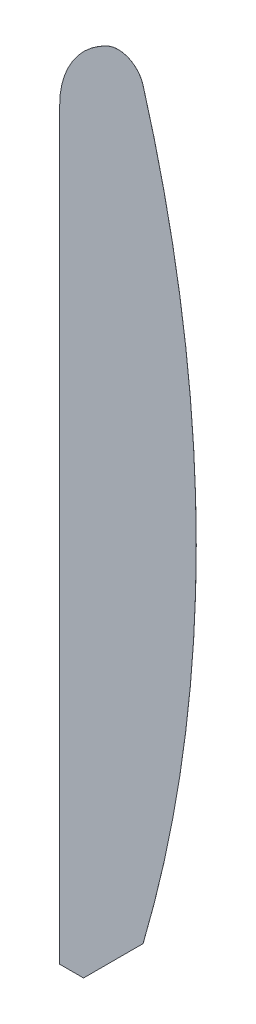
ISO-10303-21;
HEADER;
FILE_DESCRIPTION(('STEP AP214'),'2;1');
FILE_NAME('part.step','',(''),(''),'','','');
FILE_SCHEMA(('AUTOMOTIVE_DESIGN { 1 0 10303 214 1 1 1 1 }'));
ENDSEC;
DATA;
#1=APPLICATION_CONTEXT('core data for automotive mechanical design processes');
#2=APPLICATION_PROTOCOL_DEFINITION('international standard','automotive_design',2000,#1);
#3=PRODUCT_CONTEXT('',#1,'mechanical');
#4=PRODUCT('Part','Part','',(#3));
#5=PRODUCT_RELATED_PRODUCT_CATEGORY('part','',(#4));
#6=PRODUCT_DEFINITION_FORMATION('','',#4);
#7=PRODUCT_DEFINITION_CONTEXT('part definition',#1,'design');
#8=PRODUCT_DEFINITION('design','',#6,#7);
#9=PRODUCT_DEFINITION_SHAPE('','',#8);
#10=(LENGTH_UNIT() NAMED_UNIT(*) SI_UNIT(.MILLI.,.METRE.));
#11=(NAMED_UNIT(*) PLANE_ANGLE_UNIT() SI_UNIT($,.RADIAN.));
#12=(NAMED_UNIT(*) SI_UNIT($,.STERADIAN.) SOLID_ANGLE_UNIT());
#13=UNCERTAINTY_MEASURE_WITH_UNIT(LENGTH_MEASURE(1.E-05),#10,'distance_accuracy_value','');
#14=(GEOMETRIC_REPRESENTATION_CONTEXT(3) GLOBAL_UNCERTAINTY_ASSIGNED_CONTEXT((#13)) GLOBAL_UNIT_ASSIGNED_CONTEXT((#10,
#11,#12)) REPRESENTATION_CONTEXT('',''));
#15=CARTESIAN_POINT('',(0.,0.,0.));
#16=DIRECTION('',(0.,0.,1.));
#17=DIRECTION('',(1.,0.,0.));
#18=AXIS2_PLACEMENT_3D('',#15,#16,#17);
#19=CARTESIAN_POINT('',(0.,0.,0.01));
#20=DIRECTION('',(0.,1.,0.));
#21=DIRECTION('',(-1.,0.,0.));
#22=AXIS2_PLACEMENT_3D('',#19,#20,#21);
#23=PLANE('',#22);
#24=DIRECTION('',(1.,0.,0.));
#25=VECTOR('',#24,1.);
#26=CARTESIAN_POINT('',(0.,0.,0.));
#27=LINE('',#26,#25);
#28=CARTESIAN_POINT('',(0.,0.,0.));
#29=VERTEX_POINT('',#28);
#30=CARTESIAN_POINT('',(5.,0.,0.));
#31=VERTEX_POINT('',#30);
#32=EDGE_CURVE('E124',#29,#31,#27,.T.);
#33=ORIENTED_EDGE('',*,*,#32,.T.);
#34=DIRECTION('',(0.,0.,-1.));
#35=VECTOR('',#34,1.);
#36=CARTESIAN_POINT('',(5.,0.,0.01));
#37=LINE('',#36,#35);
#38=CARTESIAN_POINT('',(5.,0.,0.01));
#39=VERTEX_POINT('',#38);
#40=EDGE_CURVE('E11',#39,#31,#37,.T.);
#41=ORIENTED_EDGE('',*,*,#40,.F.);
#42=DIRECTION('',(1.,0.,0.));
#43=VECTOR('',#42,1.);
#44=CARTESIAN_POINT('',(0.,0.,0.01));
#45=LINE('',#44,#43);
#46=CARTESIAN_POINT('',(0.,0.,0.01));
#47=VERTEX_POINT('',#46);
#48=EDGE_CURVE('E137',#47,#39,#45,.T.);
#49=ORIENTED_EDGE('',*,*,#48,.F.);
#50=DIRECTION('',(0.,0.,-1.));
#51=VECTOR('',#50,1.);
#52=CARTESIAN_POINT('',(0.,0.,0.01));
#53=LINE('',#52,#51);
#54=EDGE_CURVE('E54',#47,#29,#53,.T.);
#55=ORIENTED_EDGE('',*,*,#54,.T.);
#56=EDGE_LOOP('',(#33,#41,#49,#55));
#57=FACE_BOUND('',#56,.T.);
#58=ADVANCED_FACE('F39',(#57),#23,.F.);
#59=CARTESIAN_POINT('',(5.,0.,0.01));
#60=DIRECTION('',(-0.707106781186547,0.707106781186547,0.));
#61=DIRECTION('',(-0.707106781186548,-0.707106781186548,0.));
#62=AXIS2_PLACEMENT_3D('',#59,#60,#61);
#63=PLANE('',#62);
#64=DIRECTION('',(0.707106781186547,0.707106781186547,0.));
#65=VECTOR('',#64,1.);
#66=CARTESIAN_POINT('',(5.,0.,0.));
#67=LINE('',#66,#65);
#68=CARTESIAN_POINT('',(17.4999999999999,12.4999999999999,0.));
#69=VERTEX_POINT('',#68);
#70=EDGE_CURVE('E123',#31,#69,#67,.T.);
#71=ORIENTED_EDGE('',*,*,#70,.T.);
#72=DIRECTION('',(0.,0.,-1.));
#73=VECTOR('',#72,1.);
#74=CARTESIAN_POINT('',(17.4999999999999,12.4999999999999,0.01));
#75=LINE('',#74,#73);
#76=CARTESIAN_POINT('',(17.4999999999999,12.4999999999999,0.01));
#77=VERTEX_POINT('',#76);
#78=EDGE_CURVE('E50',#77,#69,#75,.T.);
#79=ORIENTED_EDGE('',*,*,#78,.F.);
#80=DIRECTION('',(0.707106781186547,0.707106781186547,0.));
#81=VECTOR('',#80,1.);
#82=CARTESIAN_POINT('',(5.,0.,0.01));
#83=LINE('',#82,#81);
#84=EDGE_CURVE('E87',#39,#77,#83,.T.);
#85=ORIENTED_EDGE('',*,*,#84,.F.);
#86=ORIENTED_EDGE('',*,*,#40,.T.);
#87=EDGE_LOOP('',(#71,#79,#85,#86));
#88=FACE_BOUND('',#87,.T.);
#89=ADVANCED_FACE('F156',(#88),#63,.F.);
#90=CARTESIAN_POINT('',(-249.658834846102,90.5464077072573,0.01));
#91=DIRECTION('',(0.,0.,-1.));
#92=DIRECTION('',(-1.,0.,0.));
#93=AXIS2_PLACEMENT_3D('',#90,#91,#92);
#94=CYLINDRICAL_SURFACE('',#93,278.325501512769);
#95=CARTESIAN_POINT('',(-249.658834846102,90.5464077072573,0.));
#96=DIRECTION('',(0.,0.,1.));
#97=DIRECTION('',(1.,0.,0.));
#98=AXIS2_PLACEMENT_3D('',#95,#96,#97);
#99=CIRCLE('',#98,278.325501512769);
#100=CARTESIAN_POINT('',(17.5,168.592815414515,0.));
#101=VERTEX_POINT('',#100);
#102=EDGE_CURVE('E130',#69,#101,#99,.T.);
#103=ORIENTED_EDGE('',*,*,#102,.T.);
#104=DIRECTION('',(0.,0.,-1.));
#105=VECTOR('',#104,1.);
#106=CARTESIAN_POINT('',(17.5,168.592815414515,0.01));
#107=LINE('',#106,#105);
#108=CARTESIAN_POINT('',(17.5,168.592815414515,0.01));
#109=VERTEX_POINT('',#108);
#110=EDGE_CURVE('E106',#109,#101,#107,.T.);
#111=ORIENTED_EDGE('',*,*,#110,.F.);
#112=CARTESIAN_POINT('',(-249.658834846102,90.5464077072573,0.01));
#113=DIRECTION('',(0.,0.,1.));
#114=DIRECTION('',(1.,0.,0.));
#115=AXIS2_PLACEMENT_3D('',#112,#113,#114);
#116=CIRCLE('',#115,278.325501512769);
#117=EDGE_CURVE('E111',#77,#109,#116,.T.);
#118=ORIENTED_EDGE('',*,*,#117,.F.);
#119=ORIENTED_EDGE('',*,*,#78,.T.);
#120=EDGE_LOOP('',(#103,#111,#118,#119));
#121=FACE_BOUND('',#120,.T.);
#122=ADVANCED_FACE('F142',(#121),#94,.T.);
#123=CARTESIAN_POINT('',(12.2838097540245,167.068984428912,0.01));
#124=DIRECTION('',(0.,0.,-1.));
#125=DIRECTION('',(-1.,0.,0.));
#126=AXIS2_PLACEMENT_3D('',#123,#124,#125);
#127=CYLINDRICAL_SURFACE('',#126,5.43421581784276);
#128=CARTESIAN_POINT('',(12.2838097540245,167.068984428912,0.));
#129=DIRECTION('',(0.,0.,-1.));
#130=DIRECTION('',(-1.,0.,0.));
#131=AXIS2_PLACEMENT_3D('',#128,#129,#130);
#132=CIRCLE('',#131,5.43421581784276);
#133=CARTESIAN_POINT('',(10.,172.,0.));
#134=VERTEX_POINT('',#133);
#135=EDGE_CURVE('E105',#134,#101,#132,.T.);
#136=ORIENTED_EDGE('',*,*,#135,.F.);
#137=DIRECTION('',(0.,0.,-1.));
#138=VECTOR('',#137,1.);
#139=CARTESIAN_POINT('',(10.,172.,0.01));
#140=LINE('',#139,#138);
#141=CARTESIAN_POINT('',(10.,172.,0.01));
#142=VERTEX_POINT('',#141);
#143=EDGE_CURVE('E100',#142,#134,#140,.T.);
#144=ORIENTED_EDGE('',*,*,#143,.F.);
#145=CARTESIAN_POINT('',(12.2838097540245,167.068984428912,0.01));
#146=DIRECTION('',(0.,0.,-1.));
#147=DIRECTION('',(-1.,0.,0.));
#148=AXIS2_PLACEMENT_3D('',#145,#146,#147);
#149=CIRCLE('',#148,5.43421581784276);
#150=EDGE_CURVE('E99',#142,#109,#149,.T.);
#151=ORIENTED_EDGE('',*,*,#150,.T.);
#152=ORIENTED_EDGE('',*,*,#110,.T.);
#153=EDGE_LOOP('',(#136,#144,#151,#152));
#154=FACE_BOUND('',#153,.T.);
#155=ADVANCED_FACE('F97',(#154),#127,.T.);
#156=CARTESIAN_POINT('',(17.2492551999999,156.348,0.01));
#157=DIRECTION('',(0.,0.,-1.));
#158=DIRECTION('',(-1.,0.,0.));
#159=AXIS2_PLACEMENT_3D('',#156,#157,#158);
#160=CYLINDRICAL_SURFACE('',#159,17.2492551999999);
#161=CARTESIAN_POINT('',(17.2492551999999,156.348,0.));
#162=DIRECTION('',(0.,0.,-1.));
#163=DIRECTION('',(-1.,0.,0.));
#164=AXIS2_PLACEMENT_3D('',#161,#162,#163);
#165=CIRCLE('',#164,17.2492551999999);
#166=CARTESIAN_POINT('',(0.,156.348,0.));
#167=VERTEX_POINT('',#166);
#168=EDGE_CURVE('E132',#167,#134,#165,.T.);
#169=ORIENTED_EDGE('',*,*,#168,.F.);
#170=DIRECTION('',(0.,0.,-1.));
#171=VECTOR('',#170,1.);
#172=CARTESIAN_POINT('',(0.,156.348,0.01));
#173=LINE('',#172,#171);
#174=CARTESIAN_POINT('',(0.,156.348,0.01));
#175=VERTEX_POINT('',#174);
#176=EDGE_CURVE('E73',#175,#167,#173,.T.);
#177=ORIENTED_EDGE('',*,*,#176,.F.);
#178=CARTESIAN_POINT('',(17.2492551999999,156.348,0.01));
#179=DIRECTION('',(0.,0.,-1.));
#180=DIRECTION('',(-1.,0.,0.));
#181=AXIS2_PLACEMENT_3D('',#178,#179,#180);
#182=CIRCLE('',#181,17.2492551999999);
#183=EDGE_CURVE('E115',#175,#142,#182,.T.);
#184=ORIENTED_EDGE('',*,*,#183,.T.);
#185=ORIENTED_EDGE('',*,*,#143,.T.);
#186=EDGE_LOOP('',(#169,#177,#184,#185));
#187=FACE_BOUND('',#186,.T.);
#188=ADVANCED_FACE('F120',(#187),#160,.T.);
#189=CARTESIAN_POINT('',(0.,0.,0.01));
#190=DIRECTION('',(-1.,0.,0.));
#191=DIRECTION('',(0.,-1.,0.));
#192=AXIS2_PLACEMENT_3D('',#189,#190,#191);
#193=PLANE('',#192);
#194=DIRECTION('',(0.,1.,0.));
#195=VECTOR('',#194,1.);
#196=CARTESIAN_POINT('',(0.,0.,0.));
#197=LINE('',#196,#195);
#198=EDGE_CURVE('E134',#29,#167,#197,.T.);
#199=ORIENTED_EDGE('',*,*,#198,.F.);
#200=ORIENTED_EDGE('',*,*,#54,.F.);
#201=DIRECTION('',(0.,1.,0.));
#202=VECTOR('',#201,1.);
#203=CARTESIAN_POINT('',(0.,0.,0.01));
#204=LINE('',#203,#202);
#205=EDGE_CURVE('E119',#47,#175,#204,.T.);
#206=ORIENTED_EDGE('',*,*,#205,.T.);
#207=ORIENTED_EDGE('',*,*,#176,.T.);
#208=EDGE_LOOP('',(#199,#200,#206,#207));
#209=FACE_BOUND('',#208,.T.);
#210=ADVANCED_FACE('F144',(#209),#193,.T.);
#211=CARTESIAN_POINT('',(-249.658834846102,90.5464077072573,0.01));
#212=DIRECTION('',(0.,0.,1.));
#213=DIRECTION('',(1.,0.,0.));
#214=AXIS2_PLACEMENT_3D('',#211,#212,#213);
#215=PLANE('',#214);
#216=ORIENTED_EDGE('',*,*,#48,.T.);
#217=ORIENTED_EDGE('',*,*,#84,.T.);
#218=ORIENTED_EDGE('',*,*,#117,.T.);
#219=ORIENTED_EDGE('',*,*,#150,.F.);
#220=ORIENTED_EDGE('',*,*,#183,.F.);
#221=ORIENTED_EDGE('',*,*,#205,.F.);
#222=EDGE_LOOP('',(#216,#217,#218,#219,#220,#221));
#223=FACE_BOUND('',#222,.T.);
#224=ADVANCED_FACE('F109',(#223),#215,.T.);
#225=CARTESIAN_POINT('',(-249.658834846102,90.5464077072573,0.));
#226=DIRECTION('',(0.,0.,1.));
#227=DIRECTION('',(1.,0.,0.));
#228=AXIS2_PLACEMENT_3D('',#225,#226,#227);
#229=PLANE('',#228);
#230=ORIENTED_EDGE('',*,*,#32,.F.);
#231=ORIENTED_EDGE('',*,*,#198,.T.);
#232=ORIENTED_EDGE('',*,*,#168,.T.);
#233=ORIENTED_EDGE('',*,*,#135,.T.);
#234=ORIENTED_EDGE('',*,*,#102,.F.);
#235=ORIENTED_EDGE('',*,*,#70,.F.);
#236=EDGE_LOOP('',(#230,#231,#232,#233,#234,#235));
#237=FACE_BOUND('',#236,.T.);
#238=ADVANCED_FACE('F145',(#237),#229,.F.);
#239=CLOSED_SHELL('',(#58,#89,#122,#155,#188,#210,#224,#238));
#240=MANIFOLD_SOLID_BREP('B2',#239);
#241=ADVANCED_BREP_SHAPE_REPRESENTATION('',(#18,#240),#14);
#242=SHAPE_DEFINITION_REPRESENTATION(#9,#241);
ENDSEC;
END-ISO-10303-21;
